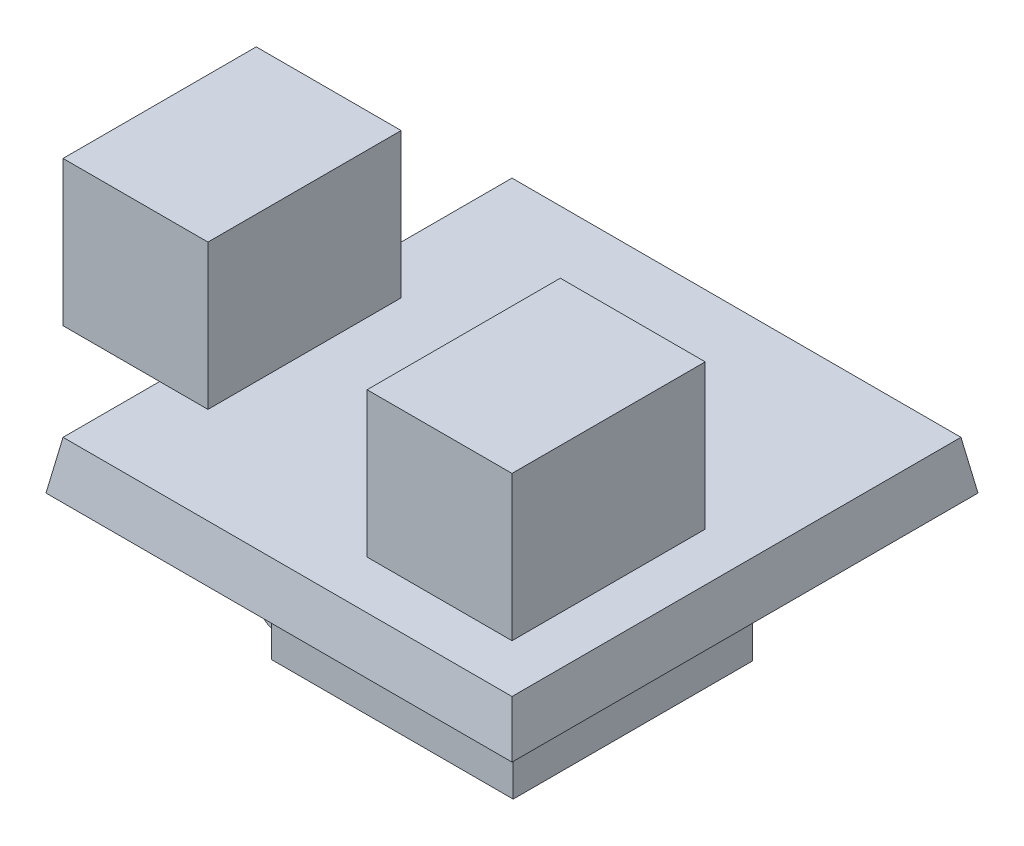
ISO-10303-21;
HEADER;
FILE_DESCRIPTION(('STEP AP214'),'2;1');
FILE_NAME('part.step','',(''),(''),'','','');
FILE_SCHEMA(('AUTOMOTIVE_DESIGN { 1 0 10303 214 1 1 1 1 }'));
ENDSEC;
DATA;
#1=APPLICATION_CONTEXT('core data for automotive mechanical design processes');
#2=APPLICATION_PROTOCOL_DEFINITION('international standard','automotive_design',2000,#1);
#3=PRODUCT_CONTEXT('',#1,'mechanical');
#4=PRODUCT('Part','Part','',(#3));
#5=PRODUCT_RELATED_PRODUCT_CATEGORY('part','',(#4));
#6=PRODUCT_DEFINITION_FORMATION('','',#4);
#7=PRODUCT_DEFINITION_CONTEXT('part definition',#1,'design');
#8=PRODUCT_DEFINITION('design','',#6,#7);
#9=PRODUCT_DEFINITION_SHAPE('','',#8);
#10=(LENGTH_UNIT() NAMED_UNIT(*) SI_UNIT(.MILLI.,.METRE.));
#11=(NAMED_UNIT(*) PLANE_ANGLE_UNIT() SI_UNIT($,.RADIAN.));
#12=(NAMED_UNIT(*) SI_UNIT($,.STERADIAN.) SOLID_ANGLE_UNIT());
#13=UNCERTAINTY_MEASURE_WITH_UNIT(LENGTH_MEASURE(1.E-05),#10,'distance_accuracy_value','');
#14=(GEOMETRIC_REPRESENTATION_CONTEXT(3) GLOBAL_UNCERTAINTY_ASSIGNED_CONTEXT((#13)) GLOBAL_UNIT_ASSIGNED_CONTEXT((#10,
#11,#12)) REPRESENTATION_CONTEXT('',''));
#15=CARTESIAN_POINT('',(0.,0.,0.));
#16=DIRECTION('',(0.,0.,1.));
#17=DIRECTION('',(1.,0.,0.));
#18=AXIS2_PLACEMENT_3D('',#15,#16,#17);
#19=CARTESIAN_POINT('',(46.4734603858307,60.,6.47346038583068));
#20=DIRECTION('',(0.,0.,1.));
#21=DIRECTION('',(1.,0.,0.));
#22=AXIS2_PLACEMENT_3D('',#19,#20,#21);
#23=PLANE('',#22);
#24=DIRECTION('',(-1.,0.,0.));
#25=VECTOR('',#24,1.);
#26=CARTESIAN_POINT('',(46.4734603858307,30.,6.47346038583068));
#27=LINE('',#26,#25);
#28=CARTESIAN_POINT('',(46.4734603858307,30.,6.47346038583068));
#29=VERTEX_POINT('',#28);
#30=CARTESIAN_POINT('',(16.4734603858307,30.,6.47346038583068));
#31=VERTEX_POINT('',#30);
#32=EDGE_CURVE('E143',#29,#31,#27,.T.);
#33=ORIENTED_EDGE('',*,*,#32,.T.);
#34=DIRECTION('',(0.,-1.,0.));
#35=VECTOR('',#34,1.);
#36=CARTESIAN_POINT('',(16.4734603858307,60.,6.47346038583068));
#37=LINE('',#36,#35);
#38=CARTESIAN_POINT('',(16.4734603858307,60.,6.47346038583068));
#39=VERTEX_POINT('',#38);
#40=EDGE_CURVE('E14',#39,#31,#37,.T.);
#41=ORIENTED_EDGE('',*,*,#40,.F.);
#42=DIRECTION('',(-1.,0.,0.));
#43=VECTOR('',#42,1.);
#44=CARTESIAN_POINT('',(46.4734603858307,60.,6.47346038583068));
#45=LINE('',#44,#43);
#46=CARTESIAN_POINT('',(46.4734603858307,60.,6.47346038583068));
#47=VERTEX_POINT('',#46);
#48=EDGE_CURVE('E120',#47,#39,#45,.T.);
#49=ORIENTED_EDGE('',*,*,#48,.F.);
#50=DIRECTION('',(0.,-1.,0.));
#51=VECTOR('',#50,1.);
#52=CARTESIAN_POINT('',(46.4734603858307,60.,6.47346038583068));
#53=LINE('',#52,#51);
#54=EDGE_CURVE('E139',#47,#29,#53,.T.);
#55=ORIENTED_EDGE('',*,*,#54,.T.);
#56=EDGE_LOOP('',(#33,#41,#49,#55));
#57=FACE_BOUND('',#56,.T.);
#58=ADVANCED_FACE('F81',(#57),#23,.F.);
#59=CARTESIAN_POINT('',(16.4734603858307,60.,46.4734603858307));
#60=DIRECTION('',(-1.,0.,0.));
#61=DIRECTION('',(0.,0.,1.));
#62=AXIS2_PLACEMENT_3D('',#59,#60,#61);
#63=PLANE('',#62);
#64=DIRECTION('',(0.,0.,-1.));
#65=VECTOR('',#64,1.);
#66=CARTESIAN_POINT('',(16.4734603858307,30.,46.4734603858307));
#67=LINE('',#66,#65);
#68=CARTESIAN_POINT('',(16.4734603858307,30.,46.4734603858307));
#69=VERTEX_POINT('',#68);
#70=EDGE_CURVE('E129',#69,#31,#67,.T.);
#71=ORIENTED_EDGE('',*,*,#70,.F.);
#72=DIRECTION('',(0.,-1.,0.));
#73=VECTOR('',#72,1.);
#74=CARTESIAN_POINT('',(16.4734603858307,60.,46.4734603858307));
#75=LINE('',#74,#73);
#76=CARTESIAN_POINT('',(16.4734603858307,60.,46.4734603858307));
#77=VERTEX_POINT('',#76);
#78=EDGE_CURVE('E89',#77,#69,#75,.T.);
#79=ORIENTED_EDGE('',*,*,#78,.F.);
#80=DIRECTION('',(0.,0.,-1.));
#81=VECTOR('',#80,1.);
#82=CARTESIAN_POINT('',(16.4734603858307,60.,46.4734603858307));
#83=LINE('',#82,#81);
#84=EDGE_CURVE('E127',#77,#39,#83,.T.);
#85=ORIENTED_EDGE('',*,*,#84,.T.);
#86=ORIENTED_EDGE('',*,*,#40,.T.);
#87=EDGE_LOOP('',(#71,#79,#85,#86));
#88=FACE_BOUND('',#87,.T.);
#89=ADVANCED_FACE('F126',(#88),#63,.T.);
#90=CARTESIAN_POINT('',(46.4734603858307,60.,46.4734603858307));
#91=DIRECTION('',(0.,0.,1.));
#92=DIRECTION('',(1.,0.,0.));
#93=AXIS2_PLACEMENT_3D('',#90,#91,#92);
#94=PLANE('',#93);
#95=DIRECTION('',(-1.,0.,0.));
#96=VECTOR('',#95,1.);
#97=CARTESIAN_POINT('',(46.4734603858307,30.,46.4734603858307));
#98=LINE('',#97,#96);
#99=CARTESIAN_POINT('',(46.4734603858307,30.,46.4734603858307));
#100=VERTEX_POINT('',#99);
#101=EDGE_CURVE('E147',#100,#69,#98,.T.);
#102=ORIENTED_EDGE('',*,*,#101,.F.);
#103=DIRECTION('',(0.,-1.,0.));
#104=VECTOR('',#103,1.);
#105=CARTESIAN_POINT('',(46.4734603858307,60.,46.4734603858307));
#106=LINE('',#105,#104);
#107=CARTESIAN_POINT('',(46.4734603858307,60.,46.4734603858307));
#108=VERTEX_POINT('',#107);
#109=EDGE_CURVE('E112',#108,#100,#106,.T.);
#110=ORIENTED_EDGE('',*,*,#109,.F.);
#111=DIRECTION('',(-1.,0.,0.));
#112=VECTOR('',#111,1.);
#113=CARTESIAN_POINT('',(46.4734603858307,60.,46.4734603858307));
#114=LINE('',#113,#112);
#115=EDGE_CURVE('E135',#108,#77,#114,.T.);
#116=ORIENTED_EDGE('',*,*,#115,.T.);
#117=ORIENTED_EDGE('',*,*,#78,.T.);
#118=EDGE_LOOP('',(#102,#110,#116,#117));
#119=FACE_BOUND('',#118,.T.);
#120=ADVANCED_FACE('F137',(#119),#94,.T.);
#121=CARTESIAN_POINT('',(46.4734603858307,60.,46.4734603858307));
#122=DIRECTION('',(-1.,0.,0.));
#123=DIRECTION('',(0.,0.,1.));
#124=AXIS2_PLACEMENT_3D('',#121,#122,#123);
#125=PLANE('',#124);
#126=DIRECTION('',(0.,0.,-1.));
#127=VECTOR('',#126,1.);
#128=CARTESIAN_POINT('',(46.4734603858307,30.,46.4734603858307));
#129=LINE('',#128,#127);
#130=EDGE_CURVE('E115',#100,#29,#129,.T.);
#131=ORIENTED_EDGE('',*,*,#130,.T.);
#132=ORIENTED_EDGE('',*,*,#54,.F.);
#133=DIRECTION('',(0.,0.,-1.));
#134=VECTOR('',#133,1.);
#135=CARTESIAN_POINT('',(46.4734603858307,60.,46.4734603858307));
#136=LINE('',#135,#134);
#137=EDGE_CURVE('E97',#108,#47,#136,.T.);
#138=ORIENTED_EDGE('',*,*,#137,.F.);
#139=ORIENTED_EDGE('',*,*,#109,.T.);
#140=EDGE_LOOP('',(#131,#132,#138,#139));
#141=FACE_BOUND('',#140,.T.);
#142=ADVANCED_FACE('F160',(#141),#125,.F.);
#143=CARTESIAN_POINT('',(0.,60.,0.));
#144=DIRECTION('',(0.,-1.,0.));
#145=DIRECTION('',(0.,0.,-1.));
#146=AXIS2_PLACEMENT_3D('',#143,#144,#145);
#147=PLANE('',#146);
#148=ORIENTED_EDGE('',*,*,#48,.T.);
#149=ORIENTED_EDGE('',*,*,#84,.F.);
#150=ORIENTED_EDGE('',*,*,#115,.F.);
#151=ORIENTED_EDGE('',*,*,#137,.T.);
#152=EDGE_LOOP('',(#148,#149,#150,#151));
#153=FACE_BOUND('',#152,.T.);
#154=ADVANCED_FACE('F134',(#153),#147,.F.);
#155=CARTESIAN_POINT('',(0.,30.,0.));
#156=DIRECTION('',(0.,-1.,0.));
#157=DIRECTION('',(0.,0.,-1.));
#158=AXIS2_PLACEMENT_3D('',#155,#156,#157);
#159=PLANE('',#158);
#160=ORIENTED_EDGE('',*,*,#32,.F.);
#161=ORIENTED_EDGE('',*,*,#130,.F.);
#162=ORIENTED_EDGE('',*,*,#101,.T.);
#163=ORIENTED_EDGE('',*,*,#70,.T.);
#164=EDGE_LOOP('',(#160,#161,#162,#163));
#165=FACE_BOUND('',#164,.T.);
#166=ADVANCED_FACE('F154',(#165),#159,.T.);
#167=CLOSED_SHELL('',(#58,#89,#120,#142,#154,#166));
#168=MANIFOLD_SOLID_BREP('B2',#167);
#169=CARTESIAN_POINT('',(-46.4734603858307,40.,6.47346038583068));
#170=DIRECTION('',(0.,0.,1.));
#171=DIRECTION('',(1.,0.,0.));
#172=AXIS2_PLACEMENT_3D('',#169,#170,#171);
#173=PLANE('',#172);
#174=DIRECTION('',(0.,1.,0.));
#175=VECTOR('',#174,1.);
#176=CARTESIAN_POINT('',(-46.4734603858307,40.,6.47346038583068));
#177=LINE('',#176,#175);
#178=CARTESIAN_POINT('',(-46.4734603858307,40.,6.47346038583068));
#179=VERTEX_POINT('',#178);
#180=CARTESIAN_POINT('',(-46.4734603858307,70.,6.47346038583068));
#181=VERTEX_POINT('',#180);
#182=EDGE_CURVE('E272',#179,#181,#177,.T.);
#183=ORIENTED_EDGE('',*,*,#182,.T.);
#184=DIRECTION('',(1.,0.,0.));
#185=VECTOR('',#184,1.);
#186=CARTESIAN_POINT('',(-46.4734603858307,70.,6.47346038583068));
#187=LINE('',#186,#185);
#188=CARTESIAN_POINT('',(-16.4734603858307,70.,6.47346038583068));
#189=VERTEX_POINT('',#188);
#190=EDGE_CURVE('E268',#181,#189,#187,.T.);
#191=ORIENTED_EDGE('',*,*,#190,.T.);
#192=DIRECTION('',(0.,1.,0.));
#193=VECTOR('',#192,1.);
#194=CARTESIAN_POINT('',(-16.4734603858307,40.,6.47346038583068));
#195=LINE('',#194,#193);
#196=CARTESIAN_POINT('',(-16.4734603858307,40.,6.47346038583068));
#197=VERTEX_POINT('',#196);
#198=EDGE_CURVE('E79',#197,#189,#195,.T.);
#199=ORIENTED_EDGE('',*,*,#198,.F.);
#200=DIRECTION('',(1.,0.,0.));
#201=VECTOR('',#200,1.);
#202=CARTESIAN_POINT('',(-46.4734603858307,40.,6.47346038583068));
#203=LINE('',#202,#201);
#204=EDGE_CURVE('E278',#179,#197,#203,.T.);
#205=ORIENTED_EDGE('',*,*,#204,.F.);
#206=EDGE_LOOP('',(#183,#191,#199,#205));
#207=FACE_BOUND('',#206,.T.);
#208=ADVANCED_FACE('F214',(#207),#173,.F.);
#209=CARTESIAN_POINT('',(-16.4734603858307,40.,46.4734603858307));
#210=DIRECTION('',(1.,0.,0.));
#211=DIRECTION('',(0.,0.,-1.));
#212=AXIS2_PLACEMENT_3D('',#209,#210,#211);
#213=PLANE('',#212);
#214=ORIENTED_EDGE('',*,*,#198,.T.);
#215=DIRECTION('',(0.,0.,-1.));
#216=VECTOR('',#215,1.);
#217=CARTESIAN_POINT('',(-16.4734603858307,70.,46.4734603858307));
#218=LINE('',#217,#216);
#219=CARTESIAN_POINT('',(-16.4734603858307,70.,46.4734603858307));
#220=VERTEX_POINT('',#219);
#221=EDGE_CURVE('E257',#220,#189,#218,.T.);
#222=ORIENTED_EDGE('',*,*,#221,.F.);
#223=DIRECTION('',(0.,1.,0.));
#224=VECTOR('',#223,1.);
#225=CARTESIAN_POINT('',(-16.4734603858307,40.,46.4734603858307));
#226=LINE('',#225,#224);
#227=CARTESIAN_POINT('',(-16.4734603858307,40.,46.4734603858307));
#228=VERTEX_POINT('',#227);
#229=EDGE_CURVE('E221',#228,#220,#226,.T.);
#230=ORIENTED_EDGE('',*,*,#229,.F.);
#231=DIRECTION('',(0.,0.,-1.));
#232=VECTOR('',#231,1.);
#233=CARTESIAN_POINT('',(-16.4734603858307,40.,46.4734603858307));
#234=LINE('',#233,#232);
#235=EDGE_CURVE('E259',#228,#197,#234,.T.);
#236=ORIENTED_EDGE('',*,*,#235,.T.);
#237=EDGE_LOOP('',(#214,#222,#230,#236));
#238=FACE_BOUND('',#237,.T.);
#239=ADVANCED_FACE('F256',(#238),#213,.T.);
#240=CARTESIAN_POINT('',(-46.4734603858307,40.,46.4734603858307));
#241=DIRECTION('',(0.,0.,1.));
#242=DIRECTION('',(1.,0.,0.));
#243=AXIS2_PLACEMENT_3D('',#240,#241,#242);
#244=PLANE('',#243);
#245=ORIENTED_EDGE('',*,*,#229,.T.);
#246=DIRECTION('',(1.,0.,0.));
#247=VECTOR('',#246,1.);
#248=CARTESIAN_POINT('',(-46.4734603858307,70.,46.4734603858307));
#249=LINE('',#248,#247);
#250=CARTESIAN_POINT('',(-46.4734603858307,70.,46.4734603858307));
#251=VERTEX_POINT('',#250);
#252=EDGE_CURVE('E270',#251,#220,#249,.T.);
#253=ORIENTED_EDGE('',*,*,#252,.F.);
#254=DIRECTION('',(0.,1.,0.));
#255=VECTOR('',#254,1.);
#256=CARTESIAN_POINT('',(-46.4734603858307,40.,46.4734603858307));
#257=LINE('',#256,#255);
#258=CARTESIAN_POINT('',(-46.4734603858307,40.,46.4734603858307));
#259=VERTEX_POINT('',#258);
#260=EDGE_CURVE('E236',#259,#251,#257,.T.);
#261=ORIENTED_EDGE('',*,*,#260,.F.);
#262=DIRECTION('',(1.,0.,0.));
#263=VECTOR('',#262,1.);
#264=CARTESIAN_POINT('',(-46.4734603858307,40.,46.4734603858307));
#265=LINE('',#264,#263);
#266=EDGE_CURVE('E281',#259,#228,#265,.T.);
#267=ORIENTED_EDGE('',*,*,#266,.T.);
#268=EDGE_LOOP('',(#245,#253,#261,#267));
#269=FACE_BOUND('',#268,.T.);
#270=ADVANCED_FACE('F285',(#269),#244,.T.);
#271=CARTESIAN_POINT('',(-46.4734603858307,40.,46.4734603858307));
#272=DIRECTION('',(1.,0.,0.));
#273=DIRECTION('',(0.,0.,-1.));
#274=AXIS2_PLACEMENT_3D('',#271,#272,#273);
#275=PLANE('',#274);
#276=ORIENTED_EDGE('',*,*,#260,.T.);
#277=DIRECTION('',(0.,0.,-1.));
#278=VECTOR('',#277,1.);
#279=CARTESIAN_POINT('',(-46.4734603858307,70.,46.4734603858307));
#280=LINE('',#279,#278);
#281=EDGE_CURVE('E276',#251,#181,#280,.T.);
#282=ORIENTED_EDGE('',*,*,#281,.T.);
#283=ORIENTED_EDGE('',*,*,#182,.F.);
#284=DIRECTION('',(0.,0.,-1.));
#285=VECTOR('',#284,1.);
#286=CARTESIAN_POINT('',(-46.4734603858307,40.,46.4734603858307));
#287=LINE('',#286,#285);
#288=EDGE_CURVE('E228',#259,#179,#287,.T.);
#289=ORIENTED_EDGE('',*,*,#288,.F.);
#290=EDGE_LOOP('',(#276,#282,#283,#289));
#291=FACE_BOUND('',#290,.T.);
#292=ADVANCED_FACE('F288',(#291),#275,.F.);
#293=CARTESIAN_POINT('',(0.,40.,0.));
#294=DIRECTION('',(0.,1.,0.));
#295=DIRECTION('',(0.,0.,1.));
#296=AXIS2_PLACEMENT_3D('',#293,#294,#295);
#297=PLANE('',#296);
#298=ORIENTED_EDGE('',*,*,#204,.T.);
#299=ORIENTED_EDGE('',*,*,#235,.F.);
#300=ORIENTED_EDGE('',*,*,#266,.F.);
#301=ORIENTED_EDGE('',*,*,#288,.T.);
#302=EDGE_LOOP('',(#298,#299,#300,#301));
#303=FACE_BOUND('',#302,.T.);
#304=ADVANCED_FACE('F286',(#303),#297,.F.);
#305=CARTESIAN_POINT('',(0.,70.,0.));
#306=DIRECTION('',(0.,1.,0.));
#307=DIRECTION('',(0.,0.,1.));
#308=AXIS2_PLACEMENT_3D('',#305,#306,#307);
#309=PLANE('',#308);
#310=ORIENTED_EDGE('',*,*,#190,.F.);
#311=ORIENTED_EDGE('',*,*,#281,.F.);
#312=ORIENTED_EDGE('',*,*,#252,.T.);
#313=ORIENTED_EDGE('',*,*,#221,.T.);
#314=EDGE_LOOP('',(#310,#311,#312,#313));
#315=FACE_BOUND('',#314,.T.);
#316=ADVANCED_FACE('F266',(#315),#309,.T.);
#317=CLOSED_SHELL('',(#208,#239,#270,#292,#304,#316));
#318=MANIFOLD_SOLID_BREP('B8',#317);
#319=CARTESIAN_POINT('',(50.,0.,-50.));
#320=DIRECTION('',(0.984807753012208,0.173648177666931,0.));
#321=DIRECTION('',(-0.173648177666931,0.984807753012208,0.));
#322=AXIS2_PLACEMENT_3D('',#319,#320,#321);
#323=PLANE('',#322);
#324=DIRECTION('',(0.,0.,-1.));
#325=VECTOR('',#324,1.);
#326=CARTESIAN_POINT('',(48.2367301929153,10.,-50.));
#327=LINE('',#326,#325);
#328=CARTESIAN_POINT('',(48.2367301929153,10.,-48.2367301929153));
#329=VERTEX_POINT('',#328);
#330=CARTESIAN_POINT('',(48.2367301929153,10.,48.2367301929153));
#331=VERTEX_POINT('',#330);
#332=EDGE_CURVE('E353',#329,#331,#327,.F.);
#333=ORIENTED_EDGE('',*,*,#332,.F.);
#334=DIRECTION('',(0.171087869746036,-0.970287525247814,-0.171087869746036));
#335=VECTOR('',#334,1.);
#336=CARTESIAN_POINT('',(47.0728940825763,16.6004425735801,-47.0728940825764));
#337=LINE('',#336,#335);
#338=CARTESIAN_POINT('',(46.4734603858307,20.,-46.4734603858307));
#339=VERTEX_POINT('',#338);
#340=EDGE_CURVE('E347',#339,#329,#337,.T.);
#341=ORIENTED_EDGE('',*,*,#340,.F.);
#342=DIRECTION('',(0.,0.,1.));
#343=VECTOR('',#342,1.);
#344=CARTESIAN_POINT('',(46.4734603858307,20.,-50.));
#345=LINE('',#344,#343);
#346=CARTESIAN_POINT('',(46.4734603858307,20.,46.4734603858307));
#347=VERTEX_POINT('',#346);
#348=EDGE_CURVE('E515',#347,#339,#345,.F.);
#349=ORIENTED_EDGE('',*,*,#348,.F.);
#350=DIRECTION('',(0.171087869746036,-0.970287525247814,0.171087869746036));
#351=VECTOR('',#350,1.);
#352=CARTESIAN_POINT('',(47.0728940825763,16.6004425735801,47.0728940825763));
#353=LINE('',#352,#351);
#354=EDGE_CURVE('E503',#347,#331,#353,.T.);
#355=ORIENTED_EDGE('',*,*,#354,.T.);
#356=EDGE_LOOP('',(#333,#341,#349,#355));
#357=FACE_BOUND('',#356,.T.);
#358=ADVANCED_FACE('F338',(#357),#323,.T.);
#359=CARTESIAN_POINT('',(-50.,0.,-50.));
#360=DIRECTION('',(0.,0.173648177666931,-0.984807753012208));
#361=DIRECTION('',(0.,0.984807753012208,0.173648177666931));
#362=AXIS2_PLACEMENT_3D('',#359,#360,#361);
#363=PLANE('',#362);
#364=DIRECTION('',(-1.,0.,0.));
#365=VECTOR('',#364,1.);
#366=CARTESIAN_POINT('',(-50.,10.,-48.2367301929153));
#367=LINE('',#366,#365);
#368=CARTESIAN_POINT('',(-48.2367301929154,10.,-48.2367301929153));
#369=VERTEX_POINT('',#368);
#370=EDGE_CURVE('E489',#369,#329,#367,.F.);
#371=ORIENTED_EDGE('',*,*,#370,.F.);
#372=DIRECTION('',(-0.171087869746036,-0.970287525247814,-0.171087869746036));
#373=VECTOR('',#372,1.);
#374=CARTESIAN_POINT('',(-50.,0.,-50.));
#375=LINE('',#374,#373);
#376=CARTESIAN_POINT('',(-46.4734603858307,20.,-46.4734603858307));
#377=VERTEX_POINT('',#376);
#378=EDGE_CURVE('E502',#377,#369,#375,.T.);
#379=ORIENTED_EDGE('',*,*,#378,.F.);
#380=DIRECTION('',(1.,0.,0.));
#381=VECTOR('',#380,1.);
#382=CARTESIAN_POINT('',(-50.,20.,-46.4734603858307));
#383=LINE('',#382,#381);
#384=EDGE_CURVE('E519',#339,#377,#383,.F.);
#385=ORIENTED_EDGE('',*,*,#384,.F.);
#386=ORIENTED_EDGE('',*,*,#340,.T.);
#387=EDGE_LOOP('',(#371,#379,#385,#386));
#388=FACE_BOUND('',#387,.T.);
#389=ADVANCED_FACE('F340',(#388),#363,.T.);
#390=CARTESIAN_POINT('',(-50.,0.,-50.));
#391=DIRECTION('',(-0.984807753012208,0.173648177666931,0.));
#392=DIRECTION('',(-0.173648177666931,-0.984807753012208,0.));
#393=AXIS2_PLACEMENT_3D('',#390,#391,#392);
#394=PLANE('',#393);
#395=DIRECTION('',(0.,0.,1.));
#396=VECTOR('',#395,1.);
#397=CARTESIAN_POINT('',(-48.2367301929154,10.,-50.));
#398=LINE('',#397,#396);
#399=CARTESIAN_POINT('',(-48.2367301929153,10.,48.2367301929153));
#400=VERTEX_POINT('',#399);
#401=EDGE_CURVE('E475',#400,#369,#398,.F.);
#402=ORIENTED_EDGE('',*,*,#401,.F.);
#403=DIRECTION('',(-0.171087869746036,-0.970287525247814,0.171087869746036));
#404=VECTOR('',#403,1.);
#405=CARTESIAN_POINT('',(-50.,0.,50.));
#406=LINE('',#405,#404);
#407=CARTESIAN_POINT('',(-46.4734603858307,20.,46.4734603858307));
#408=VERTEX_POINT('',#407);
#409=EDGE_CURVE('E507',#408,#400,#406,.T.);
#410=ORIENTED_EDGE('',*,*,#409,.F.);
#411=DIRECTION('',(0.,0.,-1.));
#412=VECTOR('',#411,1.);
#413=CARTESIAN_POINT('',(-46.4734603858307,20.,-50.));
#414=LINE('',#413,#412);
#415=EDGE_CURVE('E522',#377,#408,#414,.F.);
#416=ORIENTED_EDGE('',*,*,#415,.F.);
#417=ORIENTED_EDGE('',*,*,#378,.T.);
#418=EDGE_LOOP('',(#402,#410,#416,#417));
#419=FACE_BOUND('',#418,.T.);
#420=ADVANCED_FACE('F551',(#419),#394,.T.);
#421=CARTESIAN_POINT('',(-50.,0.,50.));
#422=DIRECTION('',(0.,0.173648177666931,0.984807753012208));
#423=DIRECTION('',(0.,-0.984807753012208,0.173648177666931));
#424=AXIS2_PLACEMENT_3D('',#421,#422,#423);
#425=PLANE('',#424);
#426=DIRECTION('',(1.,0.,0.));
#427=VECTOR('',#426,1.);
#428=CARTESIAN_POINT('',(-50.,10.,48.2367301929153));
#429=LINE('',#428,#427);
#430=EDGE_CURVE('E212',#331,#400,#429,.F.);
#431=ORIENTED_EDGE('',*,*,#430,.F.);
#432=ORIENTED_EDGE('',*,*,#354,.F.);
#433=DIRECTION('',(-1.,0.,0.));
#434=VECTOR('',#433,1.);
#435=CARTESIAN_POINT('',(-50.,20.,46.4734603858307));
#436=LINE('',#435,#434);
#437=EDGE_CURVE('E508',#408,#347,#436,.F.);
#438=ORIENTED_EDGE('',*,*,#437,.F.);
#439=ORIENTED_EDGE('',*,*,#409,.T.);
#440=EDGE_LOOP('',(#431,#432,#438,#439));
#441=FACE_BOUND('',#440,.T.);
#442=ADVANCED_FACE('F542',(#441),#425,.T.);
#443=CARTESIAN_POINT('',(0.,20.,0.));
#444=DIRECTION('',(0.,1.,0.));
#445=DIRECTION('',(0.,0.,1.));
#446=AXIS2_PLACEMENT_3D('',#443,#444,#445);
#447=PLANE('',#446);
#448=CARTESIAN_POINT('',(0.,20.,0.));
#449=DIRECTION('',(0.,1.,0.));
#450=DIRECTION('',(0.,0.,1.));
#451=AXIS2_PLACEMENT_3D('',#448,#449,#450);
#452=CIRCLE('',#451,15.);
#453=CARTESIAN_POINT('',(0.,20.,15.));
#454=VERTEX_POINT('',#453);
#455=EDGE_CURVE('E494',#454,#454,#452,.T.);
#456=ORIENTED_EDGE('',*,*,#455,.F.);
#457=EDGE_LOOP('',(#456));
#458=FACE_BOUND('',#457,.T.);
#459=ORIENTED_EDGE('',*,*,#348,.T.);
#460=ORIENTED_EDGE('',*,*,#384,.T.);
#461=ORIENTED_EDGE('',*,*,#415,.T.);
#462=ORIENTED_EDGE('',*,*,#437,.T.);
#463=EDGE_LOOP('',(#459,#460,#461,#462));
#464=FACE_BOUND('',#463,.T.);
#465=ADVANCED_FACE('F534',(#458,#464),#447,.T.);
#466=CARTESIAN_POINT('',(0.,-10.,0.));
#467=DIRECTION('',(0.,1.,0.));
#468=DIRECTION('',(0.,0.,1.));
#469=AXIS2_PLACEMENT_3D('',#466,#467,#468);
#470=CYLINDRICAL_SURFACE('',#469,15.);
#471=ORIENTED_EDGE('',*,*,#455,.T.);
#472=EDGE_LOOP('',(#471));
#473=FACE_BOUND('',#472,.T.);
#474=CARTESIAN_POINT('',(0.,0.,0.));
#475=DIRECTION('',(0.,1.,0.));
#476=DIRECTION('',(0.,0.,1.));
#477=AXIS2_PLACEMENT_3D('',#474,#475,#476);
#478=CIRCLE('',#477,15.);
#479=CARTESIAN_POINT('',(0.,0.,15.));
#480=VERTEX_POINT('',#479);
#481=EDGE_CURVE('E498',#480,#480,#478,.T.);
#482=ORIENTED_EDGE('',*,*,#481,.F.);
#483=EDGE_LOOP('',(#482));
#484=FACE_BOUND('',#483,.T.);
#485=ADVANCED_FACE('F532',(#473,#484),#470,.F.);
#486=CARTESIAN_POINT('',(0.,0.,0.));
#487=DIRECTION('',(0.,-1.,0.));
#488=DIRECTION('',(0.,0.,1.));
#489=AXIS2_PLACEMENT_3D('',#486,#487,#488);
#490=PLANE('',#489);
#491=ORIENTED_EDGE('',*,*,#481,.T.);
#492=EDGE_LOOP('',(#491));
#493=FACE_BOUND('',#492,.T.);
#494=ADVANCED_FACE('F530',(#493),#490,.F.);
#495=CARTESIAN_POINT('',(0.,10.,0.));
#496=DIRECTION('',(0.,-1.,0.));
#497=DIRECTION('',(0.,0.,-1.));
#498=AXIS2_PLACEMENT_3D('',#495,#496,#497);
#499=PLANE('',#498);
#500=DIRECTION('',(1.,0.,0.));
#501=VECTOR('',#500,1.);
#502=CARTESIAN_POINT('',(0.,10.,24.7516161221742));
#503=LINE('',#502,#501);
#504=CARTESIAN_POINT('',(-25.,10.,24.7516161221742));
#505=VERTEX_POINT('',#504);
#506=CARTESIAN_POINT('',(25.,10.,24.7516161221742));
#507=VERTEX_POINT('',#506);
#508=EDGE_CURVE('E428',#505,#507,#503,.T.);
#509=ORIENTED_EDGE('',*,*,#508,.T.);
#510=DIRECTION('',(0.,0.,-1.));
#511=VECTOR('',#510,1.);
#512=CARTESIAN_POINT('',(25.,10.,0.));
#513=LINE('',#512,#511);
#514=CARTESIAN_POINT('',(25.,10.,-24.7516161221742));
#515=VERTEX_POINT('',#514);
#516=EDGE_CURVE('E453',#507,#515,#513,.T.);
#517=ORIENTED_EDGE('',*,*,#516,.T.);
#518=DIRECTION('',(1.,0.,0.));
#519=VECTOR('',#518,1.);
#520=CARTESIAN_POINT('',(0.,10.,-24.7516161221742));
#521=LINE('',#520,#519);
#522=CARTESIAN_POINT('',(-25.,10.,-24.7516161221742));
#523=VERTEX_POINT('',#522);
#524=EDGE_CURVE('E450',#523,#515,#521,.T.);
#525=ORIENTED_EDGE('',*,*,#524,.F.);
#526=DIRECTION('',(0.,0.,-1.));
#527=VECTOR('',#526,1.);
#528=CARTESIAN_POINT('',(-25.,10.,0.));
#529=LINE('',#528,#527);
#530=CARTESIAN_POINT('',(-25.,10.,-20.));
#531=VERTEX_POINT('',#530);
#532=EDGE_CURVE('E437',#531,#523,#529,.T.);
#533=ORIENTED_EDGE('',*,*,#532,.F.);
#534=CARTESIAN_POINT('',(-25.,10.,0.));
#535=DIRECTION('',(0.,-1.,0.));
#536=DIRECTION('',(0.,0.,-1.));
#537=AXIS2_PLACEMENT_3D('',#534,#535,#536);
#538=CIRCLE('',#537,20.);
#539=CARTESIAN_POINT('',(-25.,10.,20.));
#540=VERTEX_POINT('',#539);
#541=EDGE_CURVE('E419',#540,#531,#538,.T.);
#542=ORIENTED_EDGE('',*,*,#541,.F.);
#543=EDGE_CURVE('E433',#505,#540,#529,.T.);
#544=ORIENTED_EDGE('',*,*,#543,.F.);
#545=EDGE_LOOP('',(#509,#517,#525,#533,#542,#544));
#546=FACE_BOUND('',#545,.T.);
#547=ORIENTED_EDGE('',*,*,#332,.T.);
#548=ORIENTED_EDGE('',*,*,#430,.T.);
#549=ORIENTED_EDGE('',*,*,#401,.T.);
#550=ORIENTED_EDGE('',*,*,#370,.T.);
#551=EDGE_LOOP('',(#547,#548,#549,#550));
#552=FACE_BOUND('',#551,.T.);
#553=ADVANCED_FACE('F432',(#546,#552),#499,.T.);
#554=CARTESIAN_POINT('',(-25.,10.,0.));
#555=DIRECTION('',(-1.,0.,0.));
#556=DIRECTION('',(0.,0.,1.));
#557=AXIS2_PLACEMENT_3D('',#554,#555,#556);
#558=PLANE('',#557);
#559=DIRECTION('',(0.,0.,-1.));
#560=VECTOR('',#559,1.);
#561=CARTESIAN_POINT('',(-25.,-20.,0.));
#562=LINE('',#561,#560);
#563=CARTESIAN_POINT('',(-25.,-20.,24.7516161221742));
#564=VERTEX_POINT('',#563);
#565=CARTESIAN_POINT('',(-25.,-20.,20.));
#566=VERTEX_POINT('',#565);
#567=EDGE_CURVE('E461',#564,#566,#562,.T.);
#568=ORIENTED_EDGE('',*,*,#567,.F.);
#569=DIRECTION('',(0.,-1.,0.));
#570=VECTOR('',#569,1.);
#571=CARTESIAN_POINT('',(-25.,10.,24.7516161221742));
#572=LINE('',#571,#570);
#573=EDGE_CURVE('E441',#505,#564,#572,.T.);
#574=ORIENTED_EDGE('',*,*,#573,.F.);
#575=ORIENTED_EDGE('',*,*,#543,.T.);
#576=DIRECTION('',(0.,-1.,0.));
#577=VECTOR('',#576,1.);
#578=CARTESIAN_POINT('',(-25.,10.,20.));
#579=LINE('',#578,#577);
#580=EDGE_CURVE('E416',#540,#566,#579,.T.);
#581=ORIENTED_EDGE('',*,*,#580,.T.);
#582=EDGE_LOOP('',(#568,#574,#575,#581));
#583=FACE_BOUND('',#582,.T.);
#584=ADVANCED_FACE('F440',(#583),#558,.T.);
#585=CARTESIAN_POINT('',(0.,10.,24.7516161221742));
#586=DIRECTION('',(0.,0.,-1.));
#587=DIRECTION('',(-1.,0.,0.));
#588=AXIS2_PLACEMENT_3D('',#585,#586,#587);
#589=PLANE('',#588);
#590=DIRECTION('',(1.,0.,0.));
#591=VECTOR('',#590,1.);
#592=CARTESIAN_POINT('',(0.,-20.,24.7516161221742));
#593=LINE('',#592,#591);
#594=CARTESIAN_POINT('',(25.,-20.,24.7516161221742));
#595=VERTEX_POINT('',#594);
#596=EDGE_CURVE('E443',#564,#595,#593,.T.);
#597=ORIENTED_EDGE('',*,*,#596,.T.);
#598=DIRECTION('',(0.,-1.,0.));
#599=VECTOR('',#598,1.);
#600=CARTESIAN_POINT('',(25.,10.,24.7516161221742));
#601=LINE('',#600,#599);
#602=EDGE_CURVE('E476',#507,#595,#601,.T.);
#603=ORIENTED_EDGE('',*,*,#602,.F.);
#604=ORIENTED_EDGE('',*,*,#508,.F.);
#605=ORIENTED_EDGE('',*,*,#573,.T.);
#606=EDGE_LOOP('',(#597,#603,#604,#605));
#607=FACE_BOUND('',#606,.T.);
#608=ADVANCED_FACE('F575',(#607),#589,.F.);
#609=CARTESIAN_POINT('',(25.,10.,0.));
#610=DIRECTION('',(-1.,0.,0.));
#611=DIRECTION('',(0.,0.,1.));
#612=AXIS2_PLACEMENT_3D('',#609,#610,#611);
#613=PLANE('',#612);
#614=DIRECTION('',(0.,0.,-1.));
#615=VECTOR('',#614,1.);
#616=CARTESIAN_POINT('',(25.,-20.,0.));
#617=LINE('',#616,#615);
#618=CARTESIAN_POINT('',(25.,-20.,-24.7516161221742));
#619=VERTEX_POINT('',#618);
#620=EDGE_CURVE('E447',#595,#619,#617,.T.);
#621=ORIENTED_EDGE('',*,*,#620,.T.);
#622=DIRECTION('',(0.,-1.,0.));
#623=VECTOR('',#622,1.);
#624=CARTESIAN_POINT('',(25.,10.,-24.7516161221742));
#625=LINE('',#624,#623);
#626=EDGE_CURVE('E479',#515,#619,#625,.T.);
#627=ORIENTED_EDGE('',*,*,#626,.F.);
#628=ORIENTED_EDGE('',*,*,#516,.F.);
#629=ORIENTED_EDGE('',*,*,#602,.T.);
#630=EDGE_LOOP('',(#621,#627,#628,#629));
#631=FACE_BOUND('',#630,.T.);
#632=ADVANCED_FACE('F593',(#631),#613,.F.);
#633=CARTESIAN_POINT('',(0.,10.,-24.7516161221742));
#634=DIRECTION('',(0.,0.,-1.));
#635=DIRECTION('',(-1.,0.,0.));
#636=AXIS2_PLACEMENT_3D('',#633,#634,#635);
#637=PLANE('',#636);
#638=DIRECTION('',(1.,0.,0.));
#639=VECTOR('',#638,1.);
#640=CARTESIAN_POINT('',(0.,-20.,-24.7516161221742));
#641=LINE('',#640,#639);
#642=CARTESIAN_POINT('',(-25.,-20.,-24.7516161221742));
#643=VERTEX_POINT('',#642);
#644=EDGE_CURVE('E466',#643,#619,#641,.T.);
#645=ORIENTED_EDGE('',*,*,#644,.F.);
#646=DIRECTION('',(0.,-1.,0.));
#647=VECTOR('',#646,1.);
#648=CARTESIAN_POINT('',(-25.,10.,-24.7516161221742));
#649=LINE('',#648,#647);
#650=EDGE_CURVE('E482',#523,#643,#649,.T.);
#651=ORIENTED_EDGE('',*,*,#650,.F.);
#652=ORIENTED_EDGE('',*,*,#524,.T.);
#653=ORIENTED_EDGE('',*,*,#626,.T.);
#654=EDGE_LOOP('',(#645,#651,#652,#653));
#655=FACE_BOUND('',#654,.T.);
#656=ADVANCED_FACE('F595',(#655),#637,.T.);
#657=CARTESIAN_POINT('',(-25.,-20.,-20.));
#658=VERTEX_POINT('',#657);
#659=EDGE_CURVE('E361',#658,#643,#562,.T.);
#660=ORIENTED_EDGE('',*,*,#659,.F.);
#661=DIRECTION('',(0.,-1.,0.));
#662=VECTOR('',#661,1.);
#663=CARTESIAN_POINT('',(-25.,10.,-20.));
#664=LINE('',#663,#662);
#665=EDGE_CURVE('E427',#531,#658,#664,.T.);
#666=ORIENTED_EDGE('',*,*,#665,.F.);
#667=ORIENTED_EDGE('',*,*,#532,.T.);
#668=ORIENTED_EDGE('',*,*,#650,.T.);
#669=EDGE_LOOP('',(#660,#666,#667,#668));
#670=FACE_BOUND('',#669,.T.);
#671=ADVANCED_FACE('F577',(#670),#558,.T.);
#672=CARTESIAN_POINT('',(-25.,10.,0.));
#673=DIRECTION('',(0.,-1.,0.));
#674=DIRECTION('',(0.,0.,-1.));
#675=AXIS2_PLACEMENT_3D('',#672,#673,#674);
#676=CYLINDRICAL_SURFACE('',#675,20.);
#677=CARTESIAN_POINT('',(-25.,-20.,0.));
#678=DIRECTION('',(0.,-1.,0.));
#679=DIRECTION('',(0.,0.,-1.));
#680=AXIS2_PLACEMENT_3D('',#677,#678,#679);
#681=CIRCLE('',#680,20.);
#682=EDGE_CURVE('E421',#566,#658,#681,.T.);
#683=ORIENTED_EDGE('',*,*,#682,.F.);
#684=ORIENTED_EDGE('',*,*,#580,.F.);
#685=ORIENTED_EDGE('',*,*,#541,.T.);
#686=ORIENTED_EDGE('',*,*,#665,.T.);
#687=EDGE_LOOP('',(#683,#684,#685,#686));
#688=FACE_BOUND('',#687,.T.);
#689=ADVANCED_FACE('F418',(#688),#676,.T.);
#690=CARTESIAN_POINT('',(0.,-20.,0.));
#691=DIRECTION('',(0.,-1.,0.));
#692=DIRECTION('',(0.,0.,1.));
#693=AXIS2_PLACEMENT_3D('',#690,#691,#692);
#694=PLANE('',#693);
#695=ORIENTED_EDGE('',*,*,#596,.F.);
#696=ORIENTED_EDGE('',*,*,#567,.T.);
#697=ORIENTED_EDGE('',*,*,#682,.T.);
#698=ORIENTED_EDGE('',*,*,#659,.T.);
#699=ORIENTED_EDGE('',*,*,#644,.T.);
#700=ORIENTED_EDGE('',*,*,#620,.F.);
#701=EDGE_LOOP('',(#695,#696,#697,#698,#699,#700));
#702=FACE_BOUND('',#701,.T.);
#703=ADVANCED_FACE('F580',(#702),#694,.T.);
#704=CLOSED_SHELL('',(#358,#389,#420,#442,#465,#485,#494,#553,#584,#608,#632,#656,#671,#689,#703));
#705=MANIFOLD_SOLID_BREP('B73',#704);
#706=ADVANCED_BREP_SHAPE_REPRESENTATION('',(#18,#168,#318,#705),#14);
#707=SHAPE_DEFINITION_REPRESENTATION(#9,#706);
ENDSEC;
END-ISO-10303-21;
